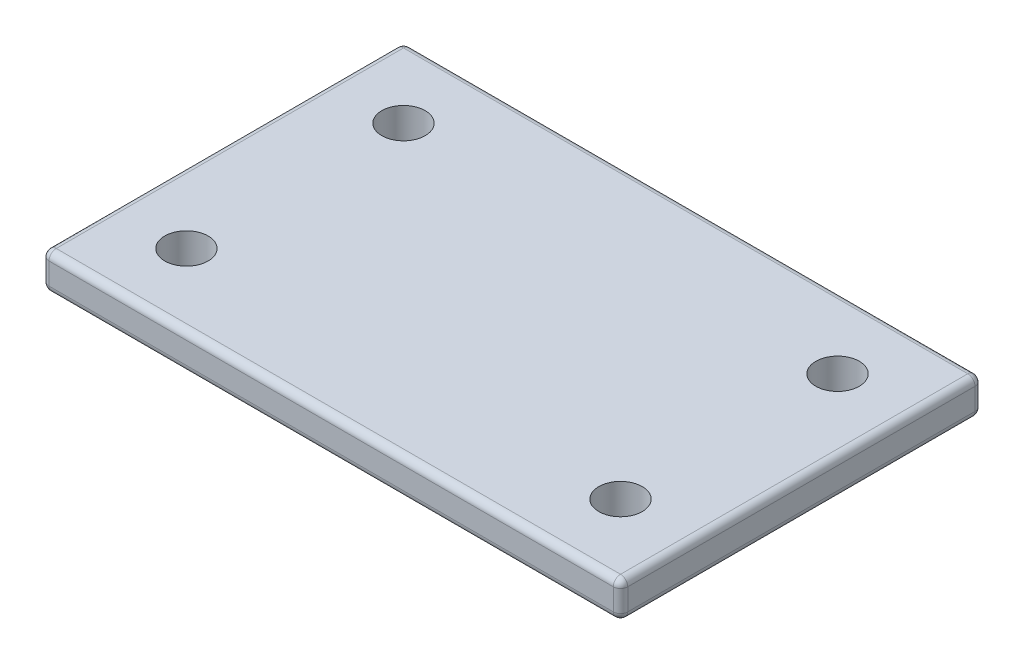
ISO-10303-21;
HEADER;
FILE_DESCRIPTION(('STEP AP214'),'2;1');
FILE_NAME('part.step','',(''),(''),'','','');
FILE_SCHEMA(('AUTOMOTIVE_DESIGN { 1 0 10303 214 1 1 1 1 }'));
ENDSEC;
DATA;
#1=APPLICATION_CONTEXT('core data for automotive mechanical design processes');
#2=APPLICATION_PROTOCOL_DEFINITION('international standard','automotive_design',2000,#1);
#3=PRODUCT_CONTEXT('',#1,'mechanical');
#4=PRODUCT('Part','Part','',(#3));
#5=PRODUCT_RELATED_PRODUCT_CATEGORY('part','',(#4));
#6=PRODUCT_DEFINITION_FORMATION('','',#4);
#7=PRODUCT_DEFINITION_CONTEXT('part definition',#1,'design');
#8=PRODUCT_DEFINITION('design','',#6,#7);
#9=PRODUCT_DEFINITION_SHAPE('','',#8);
#10=(LENGTH_UNIT() NAMED_UNIT(*) SI_UNIT(.MILLI.,.METRE.));
#11=(NAMED_UNIT(*) PLANE_ANGLE_UNIT() SI_UNIT($,.RADIAN.));
#12=(NAMED_UNIT(*) SI_UNIT($,.STERADIAN.) SOLID_ANGLE_UNIT());
#13=UNCERTAINTY_MEASURE_WITH_UNIT(LENGTH_MEASURE(1.E-05),#10,'distance_accuracy_value','');
#14=(GEOMETRIC_REPRESENTATION_CONTEXT(3) GLOBAL_UNCERTAINTY_ASSIGNED_CONTEXT((#13)) GLOBAL_UNIT_ASSIGNED_CONTEXT((#10,
#11,#12)) REPRESENTATION_CONTEXT('',''));
#15=CARTESIAN_POINT('',(0.,0.,0.));
#16=DIRECTION('',(0.,0.,1.));
#17=DIRECTION('',(1.,0.,0.));
#18=AXIS2_PLACEMENT_3D('',#15,#16,#17);
#19=CARTESIAN_POINT('',(0.,10.,0.));
#20=DIRECTION('',(0.,-1.,0.));
#21=DIRECTION('',(0.,0.,-1.));
#22=AXIS2_PLACEMENT_3D('',#19,#20,#21);
#23=PLANE('',#22);
#24=DIRECTION('',(1.,0.,0.));
#25=VECTOR('',#24,1.);
#26=CARTESIAN_POINT('',(0.,10.,48.));
#27=LINE('',#26,#25);
#28=CARTESIAN_POINT('',(-78.,10.,48.));
#29=VERTEX_POINT('',#28);
#30=CARTESIAN_POINT('',(78.,10.,48.));
#31=VERTEX_POINT('',#30);
#32=EDGE_CURVE('E165',#29,#31,#27,.T.);
#33=ORIENTED_EDGE('',*,*,#32,.T.);
#34=DIRECTION('',(0.,0.,-1.));
#35=VECTOR('',#34,1.);
#36=CARTESIAN_POINT('',(78.,10.,0.));
#37=LINE('',#36,#35);
#38=CARTESIAN_POINT('',(78.,10.,-48.));
#39=VERTEX_POINT('',#38);
#40=EDGE_CURVE('E145',#31,#39,#37,.T.);
#41=ORIENTED_EDGE('',*,*,#40,.T.);
#42=DIRECTION('',(-1.,0.,0.));
#43=VECTOR('',#42,1.);
#44=CARTESIAN_POINT('',(0.,10.,-48.));
#45=LINE('',#44,#43);
#46=CARTESIAN_POINT('',(-78.,10.,-48.));
#47=VERTEX_POINT('',#46);
#48=EDGE_CURVE('E153',#39,#47,#45,.T.);
#49=ORIENTED_EDGE('',*,*,#48,.T.);
#50=DIRECTION('',(0.,0.,1.));
#51=VECTOR('',#50,1.);
#52=CARTESIAN_POINT('',(-78.,10.,0.));
#53=LINE('',#52,#51);
#54=EDGE_CURVE('E159',#47,#29,#53,.T.);
#55=ORIENTED_EDGE('',*,*,#54,.T.);
#56=EDGE_LOOP('',(#33,#41,#49,#55));
#57=FACE_BOUND('',#56,.T.);
#58=CARTESIAN_POINT('',(-60.,10.,30.));
#59=DIRECTION('',(0.,1.,0.));
#60=DIRECTION('',(0.,0.,1.));
#61=AXIS2_PLACEMENT_3D('',#58,#59,#60);
#62=CIRCLE('',#61,6.);
#63=CARTESIAN_POINT('',(-60.,10.,36.));
#64=VERTEX_POINT('',#63);
#65=EDGE_CURVE('E344',#64,#64,#62,.T.);
#66=ORIENTED_EDGE('',*,*,#65,.F.);
#67=EDGE_LOOP('',(#66));
#68=FACE_BOUND('',#67,.T.);
#69=CARTESIAN_POINT('',(-60.,10.,-30.));
#70=DIRECTION('',(0.,1.,0.));
#71=DIRECTION('',(0.,0.,1.));
#72=AXIS2_PLACEMENT_3D('',#69,#70,#71);
#73=CIRCLE('',#72,6.);
#74=CARTESIAN_POINT('',(-60.,10.,-24.));
#75=VERTEX_POINT('',#74);
#76=EDGE_CURVE('E336',#75,#75,#73,.T.);
#77=ORIENTED_EDGE('',*,*,#76,.F.);
#78=EDGE_LOOP('',(#77));
#79=FACE_BOUND('',#78,.T.);
#80=CARTESIAN_POINT('',(60.,10.,-30.));
#81=DIRECTION('',(0.,-1.,0.));
#82=DIRECTION('',(0.,0.,-1.));
#83=AXIS2_PLACEMENT_3D('',#80,#81,#82);
#84=CIRCLE('',#83,6.);
#85=CARTESIAN_POINT('',(60.,10.,-36.));
#86=VERTEX_POINT('',#85);
#87=EDGE_CURVE('E339',#86,#86,#84,.T.);
#88=ORIENTED_EDGE('',*,*,#87,.T.);
#89=EDGE_LOOP('',(#88));
#90=FACE_BOUND('',#89,.T.);
#91=CARTESIAN_POINT('',(60.,10.,30.));
#92=DIRECTION('',(0.,-1.,0.));
#93=DIRECTION('',(0.,0.,-1.));
#94=AXIS2_PLACEMENT_3D('',#91,#92,#93);
#95=CIRCLE('',#94,6.);
#96=CARTESIAN_POINT('',(60.,10.,24.));
#97=VERTEX_POINT('',#96);
#98=EDGE_CURVE('E350',#97,#97,#95,.T.);
#99=ORIENTED_EDGE('',*,*,#98,.T.);
#100=EDGE_LOOP('',(#99));
#101=FACE_BOUND('',#100,.T.);
#102=ADVANCED_FACE('F35',(#57,#68,#79,#90,#101),#23,.F.);
#103=CARTESIAN_POINT('',(0.,0.,0.));
#104=DIRECTION('',(0.,-1.,0.));
#105=DIRECTION('',(0.,0.,-1.));
#106=AXIS2_PLACEMENT_3D('',#103,#104,#105);
#107=PLANE('',#106);
#108=DIRECTION('',(-1.,0.,0.));
#109=VECTOR('',#108,1.);
#110=CARTESIAN_POINT('',(80.,0.,-48.));
#111=LINE('',#110,#109);
#112=CARTESIAN_POINT('',(-78.,0.,-48.));
#113=VERTEX_POINT('',#112);
#114=CARTESIAN_POINT('',(78.,0.,-48.));
#115=VERTEX_POINT('',#114);
#116=EDGE_CURVE('E187',#113,#115,#111,.F.);
#117=ORIENTED_EDGE('',*,*,#116,.T.);
#118=DIRECTION('',(0.,0.,-1.));
#119=VECTOR('',#118,1.);
#120=CARTESIAN_POINT('',(78.,0.,50.));
#121=LINE('',#120,#119);
#122=CARTESIAN_POINT('',(78.,0.,48.));
#123=VERTEX_POINT('',#122);
#124=EDGE_CURVE('E190',#115,#123,#121,.F.);
#125=ORIENTED_EDGE('',*,*,#124,.T.);
#126=DIRECTION('',(1.,0.,0.));
#127=VECTOR('',#126,1.);
#128=CARTESIAN_POINT('',(-80.,0.,48.));
#129=LINE('',#128,#127);
#130=CARTESIAN_POINT('',(-78.,0.,48.));
#131=VERTEX_POINT('',#130);
#132=EDGE_CURVE('E181',#123,#131,#129,.F.);
#133=ORIENTED_EDGE('',*,*,#132,.T.);
#134=DIRECTION('',(0.,0.,1.));
#135=VECTOR('',#134,1.);
#136=CARTESIAN_POINT('',(-78.,0.,-50.));
#137=LINE('',#136,#135);
#138=EDGE_CURVE('E184',#131,#113,#137,.F.);
#139=ORIENTED_EDGE('',*,*,#138,.T.);
#140=EDGE_LOOP('',(#117,#125,#133,#139));
#141=FACE_BOUND('',#140,.T.);
#142=CARTESIAN_POINT('',(-60.,0.,30.));
#143=DIRECTION('',(0.,1.,0.));
#144=DIRECTION('',(0.,0.,1.));
#145=AXIS2_PLACEMENT_3D('',#142,#143,#144);
#146=CIRCLE('',#145,6.);
#147=CARTESIAN_POINT('',(-60.,0.,36.));
#148=VERTEX_POINT('',#147);
#149=EDGE_CURVE('E246',#148,#148,#146,.T.);
#150=ORIENTED_EDGE('',*,*,#149,.T.);
#151=EDGE_LOOP('',(#150));
#152=FACE_BOUND('',#151,.T.);
#153=CARTESIAN_POINT('',(60.,0.,-30.));
#154=DIRECTION('',(0.,-1.,0.));
#155=DIRECTION('',(0.,0.,-1.));
#156=AXIS2_PLACEMENT_3D('',#153,#154,#155);
#157=CIRCLE('',#156,6.);
#158=CARTESIAN_POINT('',(60.,0.,-36.));
#159=VERTEX_POINT('',#158);
#160=EDGE_CURVE('E353',#159,#159,#157,.T.);
#161=ORIENTED_EDGE('',*,*,#160,.F.);
#162=EDGE_LOOP('',(#161));
#163=FACE_BOUND('',#162,.T.);
#164=CARTESIAN_POINT('',(-60.,0.,-30.));
#165=DIRECTION('',(0.,1.,0.));
#166=DIRECTION('',(0.,0.,1.));
#167=AXIS2_PLACEMENT_3D('',#164,#165,#166);
#168=CIRCLE('',#167,6.);
#169=CARTESIAN_POINT('',(-60.,0.,-24.));
#170=VERTEX_POINT('',#169);
#171=EDGE_CURVE('E160',#170,#170,#168,.T.);
#172=ORIENTED_EDGE('',*,*,#171,.T.);
#173=EDGE_LOOP('',(#172));
#174=FACE_BOUND('',#173,.T.);
#175=CARTESIAN_POINT('',(60.,0.,30.));
#176=DIRECTION('',(0.,-1.,0.));
#177=DIRECTION('',(0.,0.,-1.));
#178=AXIS2_PLACEMENT_3D('',#175,#176,#177);
#179=CIRCLE('',#178,6.);
#180=CARTESIAN_POINT('',(60.,0.,24.));
#181=VERTEX_POINT('',#180);
#182=EDGE_CURVE('E347',#181,#181,#179,.T.);
#183=ORIENTED_EDGE('',*,*,#182,.F.);
#184=EDGE_LOOP('',(#183));
#185=FACE_BOUND('',#184,.T.);
#186=ADVANCED_FACE('F274',(#141,#152,#163,#174,#185),#107,.T.);
#187=CARTESIAN_POINT('',(80.,10.,50.));
#188=DIRECTION('',(-1.,0.,0.));
#189=DIRECTION('',(0.,0.,1.));
#190=AXIS2_PLACEMENT_3D('',#187,#188,#189);
#191=PLANE('',#190);
#192=DIRECTION('',(0.,0.,-1.));
#193=VECTOR('',#192,1.);
#194=CARTESIAN_POINT('',(80.,2.,-50.));
#195=LINE('',#194,#193);
#196=CARTESIAN_POINT('',(80.,2.,48.));
#197=VERTEX_POINT('',#196);
#198=CARTESIAN_POINT('',(80.,2.,-48.));
#199=VERTEX_POINT('',#198);
#200=EDGE_CURVE('E179',#197,#199,#195,.T.);
#201=ORIENTED_EDGE('',*,*,#200,.T.);
#202=DIRECTION('',(0.,-1.,0.));
#203=VECTOR('',#202,1.);
#204=CARTESIAN_POINT('',(80.,10.,-48.));
#205=LINE('',#204,#203);
#206=CARTESIAN_POINT('',(80.,8.,-48.));
#207=VERTEX_POINT('',#206);
#208=EDGE_CURVE('E11',#199,#207,#205,.F.);
#209=ORIENTED_EDGE('',*,*,#208,.T.);
#210=DIRECTION('',(0.,0.,-1.));
#211=VECTOR('',#210,1.);
#212=CARTESIAN_POINT('',(80.,8.,50.));
#213=LINE('',#212,#211);
#214=CARTESIAN_POINT('',(80.,8.,48.));
#215=VERTEX_POINT('',#214);
#216=EDGE_CURVE('E147',#207,#215,#213,.F.);
#217=ORIENTED_EDGE('',*,*,#216,.T.);
#218=DIRECTION('',(0.,-1.,0.));
#219=VECTOR('',#218,1.);
#220=CARTESIAN_POINT('',(80.,10.,48.));
#221=LINE('',#220,#219);
#222=EDGE_CURVE('E44',#215,#197,#221,.T.);
#223=ORIENTED_EDGE('',*,*,#222,.T.);
#224=EDGE_LOOP('',(#201,#209,#217,#223));
#225=FACE_BOUND('',#224,.T.);
#226=ADVANCED_FACE('F300',(#225),#191,.F.);
#227=CARTESIAN_POINT('',(-80.,10.,-50.));
#228=DIRECTION('',(0.,0.,1.));
#229=DIRECTION('',(1.,0.,0.));
#230=AXIS2_PLACEMENT_3D('',#227,#228,#229);
#231=PLANE('',#230);
#232=DIRECTION('',(-1.,0.,0.));
#233=VECTOR('',#232,1.);
#234=CARTESIAN_POINT('',(-80.,2.,-50.));
#235=LINE('',#234,#233);
#236=CARTESIAN_POINT('',(78.,2.,-50.));
#237=VERTEX_POINT('',#236);
#238=CARTESIAN_POINT('',(-78.,2.,-50.));
#239=VERTEX_POINT('',#238);
#240=EDGE_CURVE('E193',#237,#239,#235,.T.);
#241=ORIENTED_EDGE('',*,*,#240,.T.);
#242=DIRECTION('',(0.,-1.,0.));
#243=VECTOR('',#242,1.);
#244=CARTESIAN_POINT('',(-78.,10.,-50.));
#245=LINE('',#244,#243);
#246=CARTESIAN_POINT('',(-78.,8.,-50.));
#247=VERTEX_POINT('',#246);
#248=EDGE_CURVE('E232',#239,#247,#245,.F.);
#249=ORIENTED_EDGE('',*,*,#248,.T.);
#250=DIRECTION('',(-1.,0.,0.));
#251=VECTOR('',#250,1.);
#252=CARTESIAN_POINT('',(-80.,8.,-50.));
#253=LINE('',#252,#251);
#254=CARTESIAN_POINT('',(78.,8.,-50.));
#255=VERTEX_POINT('',#254);
#256=EDGE_CURVE('E177',#247,#255,#253,.F.);
#257=ORIENTED_EDGE('',*,*,#256,.T.);
#258=DIRECTION('',(0.,-1.,0.));
#259=VECTOR('',#258,1.);
#260=CARTESIAN_POINT('',(78.,10.,-50.));
#261=LINE('',#260,#259);
#262=EDGE_CURVE('E230',#255,#237,#261,.T.);
#263=ORIENTED_EDGE('',*,*,#262,.T.);
#264=EDGE_LOOP('',(#241,#249,#257,#263));
#265=FACE_BOUND('',#264,.T.);
#266=ADVANCED_FACE('F292',(#265),#231,.F.);
#267=CARTESIAN_POINT('',(-80.,10.,50.));
#268=DIRECTION('',(1.,0.,0.));
#269=DIRECTION('',(0.,0.,-1.));
#270=AXIS2_PLACEMENT_3D('',#267,#268,#269);
#271=PLANE('',#270);
#272=DIRECTION('',(0.,0.,1.));
#273=VECTOR('',#272,1.);
#274=CARTESIAN_POINT('',(-80.,8.,50.));
#275=LINE('',#274,#273);
#276=CARTESIAN_POINT('',(-80.,8.,48.));
#277=VERTEX_POINT('',#276);
#278=CARTESIAN_POINT('',(-80.,8.,-48.));
#279=VERTEX_POINT('',#278);
#280=EDGE_CURVE('E174',#277,#279,#275,.F.);
#281=ORIENTED_EDGE('',*,*,#280,.T.);
#282=DIRECTION('',(0.,-1.,0.));
#283=VECTOR('',#282,1.);
#284=CARTESIAN_POINT('',(-80.,10.,-48.));
#285=LINE('',#284,#283);
#286=CARTESIAN_POINT('',(-80.,2.,-48.));
#287=VERTEX_POINT('',#286);
#288=EDGE_CURVE('E228',#279,#287,#285,.T.);
#289=ORIENTED_EDGE('',*,*,#288,.T.);
#290=DIRECTION('',(0.,0.,1.));
#291=VECTOR('',#290,1.);
#292=CARTESIAN_POINT('',(-80.,2.,50.));
#293=LINE('',#292,#291);
#294=CARTESIAN_POINT('',(-80.,2.,48.));
#295=VERTEX_POINT('',#294);
#296=EDGE_CURVE('E196',#287,#295,#293,.T.);
#297=ORIENTED_EDGE('',*,*,#296,.T.);
#298=DIRECTION('',(0.,-1.,0.));
#299=VECTOR('',#298,1.);
#300=CARTESIAN_POINT('',(-80.,10.,48.));
#301=LINE('',#300,#299);
#302=EDGE_CURVE('E226',#295,#277,#301,.F.);
#303=ORIENTED_EDGE('',*,*,#302,.T.);
#304=EDGE_LOOP('',(#281,#289,#297,#303));
#305=FACE_BOUND('',#304,.T.);
#306=ADVANCED_FACE('F307',(#305),#271,.F.);
#307=CARTESIAN_POINT('',(-80.,10.,50.));
#308=DIRECTION('',(0.,0.,-1.));
#309=DIRECTION('',(-1.,0.,0.));
#310=AXIS2_PLACEMENT_3D('',#307,#308,#309);
#311=PLANE('',#310);
#312=DIRECTION('',(1.,0.,0.));
#313=VECTOR('',#312,1.);
#314=CARTESIAN_POINT('',(-80.,8.,50.));
#315=LINE('',#314,#313);
#316=CARTESIAN_POINT('',(78.,8.,50.));
#317=VERTEX_POINT('',#316);
#318=CARTESIAN_POINT('',(-78.,8.,50.));
#319=VERTEX_POINT('',#318);
#320=EDGE_CURVE('E167',#317,#319,#315,.F.);
#321=ORIENTED_EDGE('',*,*,#320,.T.);
#322=DIRECTION('',(0.,-1.,0.));
#323=VECTOR('',#322,1.);
#324=CARTESIAN_POINT('',(-78.,10.,50.));
#325=LINE('',#324,#323);
#326=CARTESIAN_POINT('',(-78.,2.,50.));
#327=VERTEX_POINT('',#326);
#328=EDGE_CURVE('E236',#319,#327,#325,.T.);
#329=ORIENTED_EDGE('',*,*,#328,.T.);
#330=DIRECTION('',(1.,0.,0.));
#331=VECTOR('',#330,1.);
#332=CARTESIAN_POINT('',(80.,2.,50.));
#333=LINE('',#332,#331);
#334=CARTESIAN_POINT('',(78.,2.,50.));
#335=VERTEX_POINT('',#334);
#336=EDGE_CURVE('E137',#327,#335,#333,.T.);
#337=ORIENTED_EDGE('',*,*,#336,.T.);
#338=DIRECTION('',(0.,-1.,0.));
#339=VECTOR('',#338,1.);
#340=CARTESIAN_POINT('',(78.,10.,50.));
#341=LINE('',#340,#339);
#342=EDGE_CURVE('E234',#335,#317,#341,.F.);
#343=ORIENTED_EDGE('',*,*,#342,.T.);
#344=EDGE_LOOP('',(#321,#329,#337,#343));
#345=FACE_BOUND('',#344,.T.);
#346=ADVANCED_FACE('F319',(#345),#311,.F.);
#347=CARTESIAN_POINT('',(-60.,0.,-30.));
#348=DIRECTION('',(0.,1.,0.));
#349=DIRECTION('',(0.,0.,1.));
#350=AXIS2_PLACEMENT_3D('',#347,#348,#349);
#351=CYLINDRICAL_SURFACE('',#350,6.);
#352=ORIENTED_EDGE('',*,*,#171,.F.);
#353=EDGE_LOOP('',(#352));
#354=FACE_BOUND('',#353,.T.);
#355=ORIENTED_EDGE('',*,*,#76,.T.);
#356=EDGE_LOOP('',(#355));
#357=FACE_BOUND('',#356,.T.);
#358=ADVANCED_FACE('F316',(#354,#357),#351,.F.);
#359=CARTESIAN_POINT('',(60.,0.,-30.));
#360=DIRECTION('',(0.,1.,0.));
#361=DIRECTION('',(0.,0.,1.));
#362=AXIS2_PLACEMENT_3D('',#359,#360,#361);
#363=CYLINDRICAL_SURFACE('',#362,6.);
#364=ORIENTED_EDGE('',*,*,#160,.T.);
#365=EDGE_LOOP('',(#364));
#366=FACE_BOUND('',#365,.T.);
#367=ORIENTED_EDGE('',*,*,#87,.F.);
#368=EDGE_LOOP('',(#367));
#369=FACE_BOUND('',#368,.T.);
#370=ADVANCED_FACE('F361',(#366,#369),#363,.F.);
#371=CARTESIAN_POINT('',(60.,0.,30.));
#372=DIRECTION('',(0.,1.,0.));
#373=DIRECTION('',(0.,0.,1.));
#374=AXIS2_PLACEMENT_3D('',#371,#372,#373);
#375=CYLINDRICAL_SURFACE('',#374,6.);
#376=ORIENTED_EDGE('',*,*,#182,.T.);
#377=EDGE_LOOP('',(#376));
#378=FACE_BOUND('',#377,.T.);
#379=ORIENTED_EDGE('',*,*,#98,.F.);
#380=EDGE_LOOP('',(#379));
#381=FACE_BOUND('',#380,.T.);
#382=ADVANCED_FACE('F363',(#378,#381),#375,.F.);
#383=CARTESIAN_POINT('',(-60.,0.,30.));
#384=DIRECTION('',(0.,1.,0.));
#385=DIRECTION('',(0.,0.,1.));
#386=AXIS2_PLACEMENT_3D('',#383,#384,#385);
#387=CYLINDRICAL_SURFACE('',#386,6.);
#388=ORIENTED_EDGE('',*,*,#149,.F.);
#389=EDGE_LOOP('',(#388));
#390=FACE_BOUND('',#389,.T.);
#391=ORIENTED_EDGE('',*,*,#65,.T.);
#392=EDGE_LOOP('',(#391));
#393=FACE_BOUND('',#392,.T.);
#394=ADVANCED_FACE('F370',(#390,#393),#387,.F.);
#395=CARTESIAN_POINT('',(-78.,8.,0.));
#396=DIRECTION('',(0.,0.,1.));
#397=DIRECTION('',(1.,0.,0.));
#398=AXIS2_PLACEMENT_3D('',#395,#396,#397);
#399=CYLINDRICAL_SURFACE('',#398,2.);
#400=ORIENTED_EDGE('',*,*,#54,.F.);
#401=CARTESIAN_POINT('',(-78.,8.,-48.));
#402=DIRECTION('',(0.,0.,1.));
#403=DIRECTION('',(1.,0.,0.));
#404=AXIS2_PLACEMENT_3D('',#401,#402,#403);
#405=CIRCLE('',#404,2.);
#406=EDGE_CURVE('E204',#47,#279,#405,.T.);
#407=ORIENTED_EDGE('',*,*,#406,.T.);
#408=ORIENTED_EDGE('',*,*,#280,.F.);
#409=CARTESIAN_POINT('',(-78.,8.,48.));
#410=DIRECTION('',(0.,0.,1.));
#411=DIRECTION('',(1.,0.,0.));
#412=AXIS2_PLACEMENT_3D('',#409,#410,#411);
#413=CIRCLE('',#412,2.);
#414=EDGE_CURVE('E202',#277,#29,#413,.F.);
#415=ORIENTED_EDGE('',*,*,#414,.T.);
#416=EDGE_LOOP('',(#400,#407,#408,#415));
#417=FACE_BOUND('',#416,.T.);
#418=ADVANCED_FACE('F334',(#417),#399,.T.);
#419=CARTESIAN_POINT('',(0.,8.,48.));
#420=DIRECTION('',(1.,0.,0.));
#421=DIRECTION('',(0.,0.,-1.));
#422=AXIS2_PLACEMENT_3D('',#419,#420,#421);
#423=CYLINDRICAL_SURFACE('',#422,2.);
#424=ORIENTED_EDGE('',*,*,#32,.F.);
#425=CARTESIAN_POINT('',(-78.,8.,48.));
#426=DIRECTION('',(1.,0.,0.));
#427=DIRECTION('',(0.,0.,-1.));
#428=AXIS2_PLACEMENT_3D('',#425,#426,#427);
#429=CIRCLE('',#428,2.);
#430=EDGE_CURVE('E216',#29,#319,#429,.T.);
#431=ORIENTED_EDGE('',*,*,#430,.T.);
#432=ORIENTED_EDGE('',*,*,#320,.F.);
#433=CARTESIAN_POINT('',(78.,8.,48.));
#434=DIRECTION('',(1.,0.,0.));
#435=DIRECTION('',(0.,0.,-1.));
#436=AXIS2_PLACEMENT_3D('',#433,#434,#435);
#437=CIRCLE('',#436,2.);
#438=EDGE_CURVE('E214',#317,#31,#437,.F.);
#439=ORIENTED_EDGE('',*,*,#438,.T.);
#440=EDGE_LOOP('',(#424,#431,#432,#439));
#441=FACE_BOUND('',#440,.T.);
#442=ADVANCED_FACE('F379',(#441),#423,.T.);
#443=CARTESIAN_POINT('',(0.,8.,-48.));
#444=DIRECTION('',(-1.,0.,0.));
#445=DIRECTION('',(0.,0.,1.));
#446=AXIS2_PLACEMENT_3D('',#443,#444,#445);
#447=CYLINDRICAL_SURFACE('',#446,2.);
#448=ORIENTED_EDGE('',*,*,#256,.F.);
#449=CARTESIAN_POINT('',(-78.,8.,-48.));
#450=DIRECTION('',(-1.,0.,0.));
#451=DIRECTION('',(0.,0.,1.));
#452=AXIS2_PLACEMENT_3D('',#449,#450,#451);
#453=CIRCLE('',#452,2.);
#454=EDGE_CURVE('E136',#247,#47,#453,.F.);
#455=ORIENTED_EDGE('',*,*,#454,.T.);
#456=ORIENTED_EDGE('',*,*,#48,.F.);
#457=CARTESIAN_POINT('',(78.,8.,-48.));
#458=DIRECTION('',(-1.,0.,0.));
#459=DIRECTION('',(0.,0.,1.));
#460=AXIS2_PLACEMENT_3D('',#457,#458,#459);
#461=CIRCLE('',#460,2.);
#462=EDGE_CURVE('E126',#39,#255,#461,.T.);
#463=ORIENTED_EDGE('',*,*,#462,.T.);
#464=EDGE_LOOP('',(#448,#455,#456,#463));
#465=FACE_BOUND('',#464,.T.);
#466=ADVANCED_FACE('F154',(#465),#447,.T.);
#467=CARTESIAN_POINT('',(78.,8.,0.));
#468=DIRECTION('',(0.,0.,-1.));
#469=DIRECTION('',(-1.,0.,0.));
#470=AXIS2_PLACEMENT_3D('',#467,#468,#469);
#471=CYLINDRICAL_SURFACE('',#470,2.);
#472=ORIENTED_EDGE('',*,*,#216,.F.);
#473=CARTESIAN_POINT('',(78.,8.,-48.));
#474=DIRECTION('',(0.,0.,-1.));
#475=DIRECTION('',(-1.,0.,0.));
#476=AXIS2_PLACEMENT_3D('',#473,#474,#475);
#477=CIRCLE('',#476,2.);
#478=EDGE_CURVE('E129',#207,#39,#477,.F.);
#479=ORIENTED_EDGE('',*,*,#478,.T.);
#480=ORIENTED_EDGE('',*,*,#40,.F.);
#481=CARTESIAN_POINT('',(78.,8.,48.));
#482=DIRECTION('',(0.,0.,-1.));
#483=DIRECTION('',(-1.,0.,0.));
#484=AXIS2_PLACEMENT_3D('',#481,#482,#483);
#485=CIRCLE('',#484,2.);
#486=EDGE_CURVE('E149',#31,#215,#485,.T.);
#487=ORIENTED_EDGE('',*,*,#486,.T.);
#488=EDGE_LOOP('',(#472,#479,#480,#487));
#489=FACE_BOUND('',#488,.T.);
#490=ADVANCED_FACE('F142',(#489),#471,.T.);
#491=CARTESIAN_POINT('',(-78.,2.,50.));
#492=DIRECTION('',(0.,0.,-1.));
#493=DIRECTION('',(-1.,0.,0.));
#494=AXIS2_PLACEMENT_3D('',#491,#492,#493);
#495=CYLINDRICAL_SURFACE('',#494,2.);
#496=ORIENTED_EDGE('',*,*,#296,.F.);
#497=CARTESIAN_POINT('',(-78.,2.,-48.));
#498=DIRECTION('',(0.,0.,-1.));
#499=DIRECTION('',(-1.,0.,0.));
#500=AXIS2_PLACEMENT_3D('',#497,#498,#499);
#501=CIRCLE('',#500,2.);
#502=EDGE_CURVE('E212',#287,#113,#501,.F.);
#503=ORIENTED_EDGE('',*,*,#502,.T.);
#504=ORIENTED_EDGE('',*,*,#138,.F.);
#505=CARTESIAN_POINT('',(-78.,2.,48.));
#506=DIRECTION('',(0.,0.,-1.));
#507=DIRECTION('',(-1.,0.,0.));
#508=AXIS2_PLACEMENT_3D('',#505,#506,#507);
#509=CIRCLE('',#508,2.);
#510=EDGE_CURVE('E210',#131,#295,#509,.T.);
#511=ORIENTED_EDGE('',*,*,#510,.T.);
#512=EDGE_LOOP('',(#496,#503,#504,#511));
#513=FACE_BOUND('',#512,.T.);
#514=ADVANCED_FACE('F408',(#513),#495,.T.);
#515=CARTESIAN_POINT('',(-80.,2.,48.));
#516=DIRECTION('',(-1.,0.,0.));
#517=DIRECTION('',(0.,0.,1.));
#518=AXIS2_PLACEMENT_3D('',#515,#516,#517);
#519=CYLINDRICAL_SURFACE('',#518,2.);
#520=ORIENTED_EDGE('',*,*,#336,.F.);
#521=CARTESIAN_POINT('',(-78.,2.,48.));
#522=DIRECTION('',(-1.,0.,0.));
#523=DIRECTION('',(0.,0.,1.));
#524=AXIS2_PLACEMENT_3D('',#521,#522,#523);
#525=CIRCLE('',#524,2.);
#526=EDGE_CURVE('E221',#327,#131,#525,.F.);
#527=ORIENTED_EDGE('',*,*,#526,.T.);
#528=ORIENTED_EDGE('',*,*,#132,.F.);
#529=CARTESIAN_POINT('',(78.,2.,48.));
#530=DIRECTION('',(-1.,0.,0.));
#531=DIRECTION('',(0.,0.,1.));
#532=AXIS2_PLACEMENT_3D('',#529,#530,#531);
#533=CIRCLE('',#532,2.);
#534=EDGE_CURVE('E219',#123,#335,#533,.T.);
#535=ORIENTED_EDGE('',*,*,#534,.T.);
#536=EDGE_LOOP('',(#520,#527,#528,#535));
#537=FACE_BOUND('',#536,.T.);
#538=ADVANCED_FACE('F270',(#537),#519,.T.);
#539=CARTESIAN_POINT('',(-80.,2.,-48.));
#540=DIRECTION('',(1.,0.,0.));
#541=DIRECTION('',(0.,0.,-1.));
#542=AXIS2_PLACEMENT_3D('',#539,#540,#541);
#543=CYLINDRICAL_SURFACE('',#542,2.);
#544=ORIENTED_EDGE('',*,*,#116,.F.);
#545=CARTESIAN_POINT('',(-78.,2.,-48.));
#546=DIRECTION('',(1.,0.,0.));
#547=DIRECTION('',(0.,0.,-1.));
#548=AXIS2_PLACEMENT_3D('',#545,#546,#547);
#549=CIRCLE('',#548,2.);
#550=EDGE_CURVE('E208',#113,#239,#549,.T.);
#551=ORIENTED_EDGE('',*,*,#550,.T.);
#552=ORIENTED_EDGE('',*,*,#240,.F.);
#553=CARTESIAN_POINT('',(78.,2.,-48.));
#554=DIRECTION('',(1.,0.,0.));
#555=DIRECTION('',(0.,0.,-1.));
#556=AXIS2_PLACEMENT_3D('',#553,#554,#555);
#557=CIRCLE('',#556,2.);
#558=EDGE_CURVE('E206',#237,#115,#557,.F.);
#559=ORIENTED_EDGE('',*,*,#558,.T.);
#560=EDGE_LOOP('',(#544,#551,#552,#559));
#561=FACE_BOUND('',#560,.T.);
#562=ADVANCED_FACE('F279',(#561),#543,.T.);
#563=CARTESIAN_POINT('',(78.,2.,50.));
#564=DIRECTION('',(0.,0.,1.));
#565=DIRECTION('',(1.,0.,0.));
#566=AXIS2_PLACEMENT_3D('',#563,#564,#565);
#567=CYLINDRICAL_SURFACE('',#566,2.);
#568=ORIENTED_EDGE('',*,*,#124,.F.);
#569=CARTESIAN_POINT('',(78.,2.,-48.));
#570=DIRECTION('',(0.,0.,1.));
#571=DIRECTION('',(1.,0.,0.));
#572=AXIS2_PLACEMENT_3D('',#569,#570,#571);
#573=CIRCLE('',#572,2.);
#574=EDGE_CURVE('E52',#115,#199,#573,.T.);
#575=ORIENTED_EDGE('',*,*,#574,.T.);
#576=ORIENTED_EDGE('',*,*,#200,.F.);
#577=CARTESIAN_POINT('',(78.,2.,48.));
#578=DIRECTION('',(0.,0.,1.));
#579=DIRECTION('',(1.,0.,0.));
#580=AXIS2_PLACEMENT_3D('',#577,#578,#579);
#581=CIRCLE('',#580,2.);
#582=EDGE_CURVE('E148',#197,#123,#581,.F.);
#583=ORIENTED_EDGE('',*,*,#582,.T.);
#584=EDGE_LOOP('',(#568,#575,#576,#583));
#585=FACE_BOUND('',#584,.T.);
#586=ADVANCED_FACE('F267',(#585),#567,.T.);
#587=CARTESIAN_POINT('',(-78.,2.,-48.));
#588=DIRECTION('',(0.,0.,1.));
#589=DIRECTION('',(1.,0.,0.));
#590=AXIS2_PLACEMENT_3D('',#587,#588,#589);
#591=SPHERICAL_SURFACE('',#590,2.);
#592=ORIENTED_EDGE('',*,*,#550,.F.);
#593=ORIENTED_EDGE('',*,*,#502,.F.);
#594=CARTESIAN_POINT('',(-78.,2.,-48.));
#595=DIRECTION('',(0.,1.,0.));
#596=DIRECTION('',(0.,0.,1.));
#597=AXIS2_PLACEMENT_3D('',#594,#595,#596);
#598=CIRCLE('',#597,2.);
#599=EDGE_CURVE('E242',#239,#287,#598,.T.);
#600=ORIENTED_EDGE('',*,*,#599,.F.);
#601=EDGE_LOOP('',(#592,#593,#600));
#602=FACE_BOUND('',#601,.T.);
#603=ADVANCED_FACE('F285',(#602),#591,.T.);
#604=CARTESIAN_POINT('',(-78.,10.,-48.));
#605=DIRECTION('',(0.,-1.,0.));
#606=DIRECTION('',(0.,0.,-1.));
#607=AXIS2_PLACEMENT_3D('',#604,#605,#606);
#608=CYLINDRICAL_SURFACE('',#607,2.);
#609=ORIENTED_EDGE('',*,*,#599,.T.);
#610=ORIENTED_EDGE('',*,*,#288,.F.);
#611=CARTESIAN_POINT('',(-78.,8.,-48.));
#612=DIRECTION('',(0.,1.,0.));
#613=DIRECTION('',(0.,0.,1.));
#614=AXIS2_PLACEMENT_3D('',#611,#612,#613);
#615=CIRCLE('',#614,2.);
#616=EDGE_CURVE('E239',#247,#279,#615,.T.);
#617=ORIENTED_EDGE('',*,*,#616,.F.);
#618=ORIENTED_EDGE('',*,*,#248,.F.);
#619=EDGE_LOOP('',(#609,#610,#617,#618));
#620=FACE_BOUND('',#619,.T.);
#621=ADVANCED_FACE('F290',(#620),#608,.T.);
#622=CARTESIAN_POINT('',(-78.,8.,-48.));
#623=DIRECTION('',(0.,0.,1.));
#624=DIRECTION('',(1.,0.,0.));
#625=AXIS2_PLACEMENT_3D('',#622,#623,#624);
#626=SPHERICAL_SURFACE('',#625,2.);
#627=ORIENTED_EDGE('',*,*,#616,.T.);
#628=ORIENTED_EDGE('',*,*,#406,.F.);
#629=ORIENTED_EDGE('',*,*,#454,.F.);
#630=EDGE_LOOP('',(#627,#628,#629));
#631=FACE_BOUND('',#630,.T.);
#632=ADVANCED_FACE('F333',(#631),#626,.T.);
#633=CARTESIAN_POINT('',(-78.,2.,48.));
#634=DIRECTION('',(0.,0.,1.));
#635=DIRECTION('',(1.,0.,0.));
#636=AXIS2_PLACEMENT_3D('',#633,#634,#635);
#637=SPHERICAL_SURFACE('',#636,2.);
#638=ORIENTED_EDGE('',*,*,#510,.F.);
#639=ORIENTED_EDGE('',*,*,#526,.F.);
#640=CARTESIAN_POINT('',(-78.,2.,48.));
#641=DIRECTION('',(0.,1.,0.));
#642=DIRECTION('',(0.,0.,1.));
#643=AXIS2_PLACEMENT_3D('',#640,#641,#642);
#644=CIRCLE('',#643,2.);
#645=EDGE_CURVE('E243',#295,#327,#644,.T.);
#646=ORIENTED_EDGE('',*,*,#645,.F.);
#647=EDGE_LOOP('',(#638,#639,#646));
#648=FACE_BOUND('',#647,.T.);
#649=ADVANCED_FACE('F414',(#648),#637,.T.);
#650=CARTESIAN_POINT('',(-78.,10.,48.));
#651=DIRECTION('',(0.,-1.,0.));
#652=DIRECTION('',(0.,0.,-1.));
#653=AXIS2_PLACEMENT_3D('',#650,#651,#652);
#654=CYLINDRICAL_SURFACE('',#653,2.);
#655=ORIENTED_EDGE('',*,*,#645,.T.);
#656=ORIENTED_EDGE('',*,*,#328,.F.);
#657=CARTESIAN_POINT('',(-78.,8.,48.));
#658=DIRECTION('',(0.,1.,0.));
#659=DIRECTION('',(0.,0.,1.));
#660=AXIS2_PLACEMENT_3D('',#657,#658,#659);
#661=CIRCLE('',#660,2.);
#662=EDGE_CURVE('E247',#277,#319,#661,.T.);
#663=ORIENTED_EDGE('',*,*,#662,.F.);
#664=ORIENTED_EDGE('',*,*,#302,.F.);
#665=EDGE_LOOP('',(#655,#656,#663,#664));
#666=FACE_BOUND('',#665,.T.);
#667=ADVANCED_FACE('F422',(#666),#654,.T.);
#668=CARTESIAN_POINT('',(-78.,8.,48.));
#669=DIRECTION('',(0.,0.,1.));
#670=DIRECTION('',(1.,0.,0.));
#671=AXIS2_PLACEMENT_3D('',#668,#669,#670);
#672=SPHERICAL_SURFACE('',#671,2.);
#673=ORIENTED_EDGE('',*,*,#430,.F.);
#674=ORIENTED_EDGE('',*,*,#414,.F.);
#675=ORIENTED_EDGE('',*,*,#662,.T.);
#676=EDGE_LOOP('',(#673,#674,#675));
#677=FACE_BOUND('',#676,.T.);
#678=ADVANCED_FACE('F419',(#677),#672,.T.);
#679=CARTESIAN_POINT('',(78.,2.,-48.));
#680=DIRECTION('',(0.,0.,1.));
#681=DIRECTION('',(1.,0.,0.));
#682=AXIS2_PLACEMENT_3D('',#679,#680,#681);
#683=SPHERICAL_SURFACE('',#682,2.);
#684=ORIENTED_EDGE('',*,*,#574,.F.);
#685=ORIENTED_EDGE('',*,*,#558,.F.);
#686=CARTESIAN_POINT('',(78.,2.,-48.));
#687=DIRECTION('',(0.,1.,0.));
#688=DIRECTION('',(0.,0.,1.));
#689=AXIS2_PLACEMENT_3D('',#686,#687,#688);
#690=CIRCLE('',#689,2.);
#691=EDGE_CURVE('E249',#199,#237,#690,.T.);
#692=ORIENTED_EDGE('',*,*,#691,.F.);
#693=EDGE_LOOP('',(#684,#685,#692));
#694=FACE_BOUND('',#693,.T.);
#695=ADVANCED_FACE('F296',(#694),#683,.T.);
#696=CARTESIAN_POINT('',(78.,10.,-48.));
#697=DIRECTION('',(0.,-1.,0.));
#698=DIRECTION('',(0.,0.,-1.));
#699=AXIS2_PLACEMENT_3D('',#696,#697,#698);
#700=CYLINDRICAL_SURFACE('',#699,2.);
#701=ORIENTED_EDGE('',*,*,#691,.T.);
#702=ORIENTED_EDGE('',*,*,#262,.F.);
#703=CARTESIAN_POINT('',(78.,8.,-48.));
#704=DIRECTION('',(0.,1.,0.));
#705=DIRECTION('',(0.,0.,1.));
#706=AXIS2_PLACEMENT_3D('',#703,#704,#705);
#707=CIRCLE('',#706,2.);
#708=EDGE_CURVE('E131',#207,#255,#707,.T.);
#709=ORIENTED_EDGE('',*,*,#708,.F.);
#710=ORIENTED_EDGE('',*,*,#208,.F.);
#711=EDGE_LOOP('',(#701,#702,#709,#710));
#712=FACE_BOUND('',#711,.T.);
#713=ADVANCED_FACE('F299',(#712),#700,.T.);
#714=CARTESIAN_POINT('',(78.,8.,-48.));
#715=DIRECTION('',(0.,0.,1.));
#716=DIRECTION('',(1.,0.,0.));
#717=AXIS2_PLACEMENT_3D('',#714,#715,#716);
#718=SPHERICAL_SURFACE('',#717,2.);
#719=ORIENTED_EDGE('',*,*,#708,.T.);
#720=ORIENTED_EDGE('',*,*,#462,.F.);
#721=ORIENTED_EDGE('',*,*,#478,.F.);
#722=EDGE_LOOP('',(#719,#720,#721));
#723=FACE_BOUND('',#722,.T.);
#724=ADVANCED_FACE('F128',(#723),#718,.T.);
#725=CARTESIAN_POINT('',(78.,2.,48.));
#726=DIRECTION('',(0.,0.,1.));
#727=DIRECTION('',(1.,0.,0.));
#728=AXIS2_PLACEMENT_3D('',#725,#726,#727);
#729=SPHERICAL_SURFACE('',#728,2.);
#730=ORIENTED_EDGE('',*,*,#534,.F.);
#731=ORIENTED_EDGE('',*,*,#582,.F.);
#732=CARTESIAN_POINT('',(78.,2.,48.));
#733=DIRECTION('',(0.,1.,0.));
#734=DIRECTION('',(0.,0.,1.));
#735=AXIS2_PLACEMENT_3D('',#732,#733,#734);
#736=CIRCLE('',#735,2.);
#737=EDGE_CURVE('E39',#335,#197,#736,.T.);
#738=ORIENTED_EDGE('',*,*,#737,.F.);
#739=EDGE_LOOP('',(#730,#731,#738));
#740=FACE_BOUND('',#739,.T.);
#741=ADVANCED_FACE('F37',(#740),#729,.T.);
#742=CARTESIAN_POINT('',(78.,10.,48.));
#743=DIRECTION('',(0.,-1.,0.));
#744=DIRECTION('',(0.,0.,-1.));
#745=AXIS2_PLACEMENT_3D('',#742,#743,#744);
#746=CYLINDRICAL_SURFACE('',#745,2.);
#747=ORIENTED_EDGE('',*,*,#737,.T.);
#748=ORIENTED_EDGE('',*,*,#222,.F.);
#749=CARTESIAN_POINT('',(78.,8.,48.));
#750=DIRECTION('',(0.,1.,0.));
#751=DIRECTION('',(0.,0.,1.));
#752=AXIS2_PLACEMENT_3D('',#749,#750,#751);
#753=CIRCLE('',#752,2.);
#754=EDGE_CURVE('E254',#317,#215,#753,.T.);
#755=ORIENTED_EDGE('',*,*,#754,.F.);
#756=ORIENTED_EDGE('',*,*,#342,.F.);
#757=EDGE_LOOP('',(#747,#748,#755,#756));
#758=FACE_BOUND('',#757,.T.);
#759=ADVANCED_FACE('F262',(#758),#746,.T.);
#760=CARTESIAN_POINT('',(78.,8.,48.));
#761=DIRECTION('',(0.,0.,1.));
#762=DIRECTION('',(1.,0.,0.));
#763=AXIS2_PLACEMENT_3D('',#760,#761,#762);
#764=SPHERICAL_SURFACE('',#763,2.);
#765=ORIENTED_EDGE('',*,*,#486,.F.);
#766=ORIENTED_EDGE('',*,*,#438,.F.);
#767=ORIENTED_EDGE('',*,*,#754,.T.);
#768=EDGE_LOOP('',(#765,#766,#767));
#769=FACE_BOUND('',#768,.T.);
#770=ADVANCED_FACE('F436',(#769),#764,.T.);
#771=CLOSED_SHELL('',(#102,#186,#226,#266,#306,#346,#358,#370,#382,#394,#418,#442,#466,#490,
#514,#538,#562,#586,#603,#621,#632,#649,#667,#678,#695,#713,#724,#741,#759,#770));
#772=MANIFOLD_SOLID_BREP('B2',#771);
#773=ADVANCED_BREP_SHAPE_REPRESENTATION('',(#18,#772),#14);
#774=SHAPE_DEFINITION_REPRESENTATION(#9,#773);
ENDSEC;
END-ISO-10303-21;
